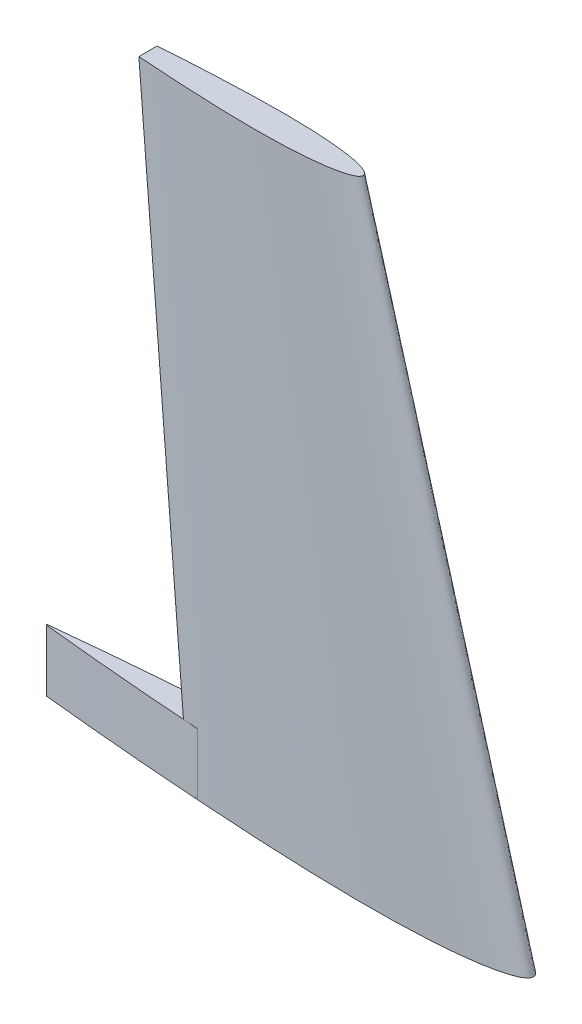
ISO-10303-21;
HEADER;
FILE_DESCRIPTION(('STEP AP214'),'2;1');
FILE_NAME('part.step','',(''),(''),'','','');
FILE_SCHEMA(('AUTOMOTIVE_DESIGN { 1 0 10303 214 1 1 1 1 }'));
ENDSEC;
DATA;
#1=APPLICATION_CONTEXT('core data for automotive mechanical design processes');
#2=APPLICATION_PROTOCOL_DEFINITION('international standard','automotive_design',2000,#1);
#3=PRODUCT_CONTEXT('',#1,'mechanical');
#4=PRODUCT('Part','Part','',(#3));
#5=PRODUCT_RELATED_PRODUCT_CATEGORY('part','',(#4));
#6=PRODUCT_DEFINITION_FORMATION('','',#4);
#7=PRODUCT_DEFINITION_CONTEXT('part definition',#1,'design');
#8=PRODUCT_DEFINITION('design','',#6,#7);
#9=PRODUCT_DEFINITION_SHAPE('','',#8);
#10=(LENGTH_UNIT() NAMED_UNIT(*) SI_UNIT(.MILLI.,.METRE.));
#11=(NAMED_UNIT(*) PLANE_ANGLE_UNIT() SI_UNIT($,.RADIAN.));
#12=(NAMED_UNIT(*) SI_UNIT($,.STERADIAN.) SOLID_ANGLE_UNIT());
#13=UNCERTAINTY_MEASURE_WITH_UNIT(LENGTH_MEASURE(1.E-05),#10,'distance_accuracy_value','');
#14=(GEOMETRIC_REPRESENTATION_CONTEXT(3) GLOBAL_UNCERTAINTY_ASSIGNED_CONTEXT((#13)) GLOBAL_UNIT_ASSIGNED_CONTEXT((#10,
#11,#12)) REPRESENTATION_CONTEXT('',''));
#15=CARTESIAN_POINT('',(0.,0.,0.));
#16=DIRECTION('',(0.,0.,1.));
#17=DIRECTION('',(1.,0.,0.));
#18=AXIS2_PLACEMENT_3D('',#15,#16,#17);
#19=CARTESIAN_POINT('',(-112.239366573117,-10.0566351564144,0.));
#20=DIRECTION('',(0.996009938224666,0.0892423831914909,0.));
#21=DIRECTION('',(-0.0892423831914909,0.996009938224666,0.));
#22=AXIS2_PLACEMENT_3D('',#19,#20,#21);
#23=PLANE('',#22);
#24=DIRECTION('',(0.,0.,-1.));
#25=VECTOR('',#24,1.);
#26=CARTESIAN_POINT('',(-115.022037738233,21.,0.));
#27=LINE('',#26,#25);
#28=CARTESIAN_POINT('',(-115.022037738233,21.,4.63619765220929));
#29=VERTEX_POINT('',#28);
#30=CARTESIAN_POINT('',(-115.022037738233,21.,-4.63619765220929));
#31=VERTEX_POINT('',#30);
#32=EDGE_CURVE('E135',#29,#31,#27,.T.);
#33=ORIENTED_EDGE('',*,*,#32,.F.);
#34=DIRECTION('',(-0.0892394877157666,0.995977622608541,-0.00805537679227205));
#35=VECTOR('',#34,1.);
#36=CARTESIAN_POINT('',(-113.14044,0.,4.80604374995059));
#37=LINE('',#36,#35);
#38=CARTESIAN_POINT('',(-131.775336,207.979,3.12392843746788));
#39=VERTEX_POINT('',#38);
#40=EDGE_CURVE('E147',#29,#39,#37,.T.);
#41=ORIENTED_EDGE('',*,*,#40,.T.);
#42=DIRECTION('',(0.,0.,1.));
#43=VECTOR('',#42,1.);
#44=CARTESIAN_POINT('',(-131.775336,207.979,-3.12392843746788));
#45=LINE('',#44,#43);
#46=CARTESIAN_POINT('',(-131.775336,207.979,-3.12392843746788));
#47=VERTEX_POINT('',#46);
#48=EDGE_CURVE('E155',#47,#39,#45,.T.);
#49=ORIENTED_EDGE('',*,*,#48,.F.);
#50=DIRECTION('',(-0.0892394877157666,0.995977622608541,0.00805537679227205));
#51=VECTOR('',#50,1.);
#52=CARTESIAN_POINT('',(-113.14044,0.,-4.80604374995059));
#53=LINE('',#52,#51);
#54=EDGE_CURVE('E148',#31,#47,#53,.T.);
#55=ORIENTED_EDGE('',*,*,#54,.F.);
#56=EDGE_LOOP('',(#33,#41,#49,#55));
#57=FACE_BOUND('',#56,.T.);
#58=ADVANCED_FACE('F41',(#57),#23,.F.);
#59=CARTESIAN_POINT('',(-113.14044,0.,4.80604374995059));
#60=CARTESIAN_POINT('',(-131.775336,207.979,3.12392843746788));
#61=CARTESIAN_POINT('',(-111.726732710091,0.,4.90713052679197));
#62=CARTESIAN_POINT('',(-130.856426261559,207.979,3.18963484241478));
#63=CARTESIAN_POINT('',(-107.510535807038,0.,5.20860860397274));
#64=CARTESIAN_POINT('',(-128.115898274575,207.979,3.38559559258228));
#65=CARTESIAN_POINT('',(-100.426385122024,0.,5.66512035387463));
#66=CARTESIAN_POINT('',(-123.511200329316,207.979,3.68232823001851));
#67=CARTESIAN_POINT('',(-91.8573991631088,0.,6.17181704190395));
#68=CARTESIAN_POINT('',(-117.941359456021,207.979,4.01168107723757));
#69=CARTESIAN_POINT('',(-83.1932560029528,0.,6.61846814689898));
#70=CARTESIAN_POINT('',(-112.309666401919,207.979,4.30200429548434));
#71=CARTESIAN_POINT('',(-74.5290382225057,0.,6.99169504156081));
#72=CARTESIAN_POINT('',(-106.677924844629,207.979,4.54460177701453));
#73=CARTESIAN_POINT('',(-65.959549844099,0.,7.27452823306303));
#74=CARTESIAN_POINT('',(-101.107757398664,207.979,4.72844335149097));
#75=CARTESIAN_POINT('',(-57.578619637256,0.,7.45200157022249));
#76=CARTESIAN_POINT('',(-95.6601527642164,207.979,4.84380102064462));
#77=CARTESIAN_POINT('',(-49.4779845535848,0.,7.51083783643772));
#78=CARTESIAN_POINT('',(-90.3947399598301,207.979,4.88204459368452));
#79=CARTESIAN_POINT('',(-41.7463108736929,0.,7.440783256186));
#80=CARTESIAN_POINT('',(-85.3691520679004,207.979,4.8365091165209));
#81=CARTESIAN_POINT('',(-34.468189505098,0.,7.23543189831716));
#82=CARTESIAN_POINT('',(-80.6383731783137,207.979,4.70303073390616));
#83=CARTESIAN_POINT('',(-27.7232217122839,0.,6.89282626183877));
#84=CARTESIAN_POINT('',(-76.2541441129845,207.979,4.4803370701952));
#85=CARTESIAN_POINT('',(-21.58491618977,0.,6.41597440914091));
#86=CARTESIAN_POINT('',(-72.2642455233505,207.979,4.1703833659416));
#87=CARTESIAN_POINT('',(-16.1202197147915,0.,5.81199661703474));
#88=CARTESIAN_POINT('',(-68.7121928146145,207.979,3.77779780107258));
#89=CARTESIAN_POINT('',(-11.3868645139334,0.,5.09394784864563));
#90=CARTESIAN_POINT('',(-65.6355119340567,207.979,3.31106610161966));
#91=CARTESIAN_POINT('',(-7.43652337095124,0.,4.27300728957677));
#92=CARTESIAN_POINT('',(-63.0677901911183,207.979,2.7774547382249));
#93=CARTESIAN_POINT('',(-4.29811628529668,0.,3.3773895414827));
#94=CARTESIAN_POINT('',(-61.0278255854428,207.979,2.19530320196376));
#95=CARTESIAN_POINT('',(-2.00522037449469,0.,2.39406602277235));
#96=CARTESIAN_POINT('',(-59.5374432434215,207.979,1.55614291480203));
#97=CARTESIAN_POINT('',(-0.477736378413801,0.,1.37816814860217));
#98=CARTESIAN_POINT('',(-58.544578645969,207.979,0.895809296591408));
#99=CARTESIAN_POINT('',(0.197509287891895,0.,0.));
#100=CARTESIAN_POINT('',(-58.1056689628703,207.979,0.));
#101=CARTESIAN_POINT('',(-0.477736378413796,0.,-1.37816814860216));
#102=CARTESIAN_POINT('',(-58.544578645969,207.979,-0.895809296591398));
#103=CARTESIAN_POINT('',(-2.0052203744947,0.,-2.39406602277236));
#104=CARTESIAN_POINT('',(-59.5374432434216,207.979,-1.55614291480204));
#105=CARTESIAN_POINT('',(-4.29811628529668,0.,-3.3773895414827));
#106=CARTESIAN_POINT('',(-61.0278255854428,207.979,-2.19530320196376));
#107=CARTESIAN_POINT('',(-7.43652337095122,0.,-4.27300728957676));
#108=CARTESIAN_POINT('',(-63.0677901911183,207.979,-2.77745473822489));
#109=CARTESIAN_POINT('',(-11.3868645139334,0.,-5.09394784864563));
#110=CARTESIAN_POINT('',(-65.6355119340567,207.979,-3.31106610161966));
#111=CARTESIAN_POINT('',(-16.1202197147915,0.,-5.81199661703474));
#112=CARTESIAN_POINT('',(-68.7121928146145,207.979,-3.77779780107258));
#113=CARTESIAN_POINT('',(-21.58491618977,0.,-6.41597440914091));
#114=CARTESIAN_POINT('',(-72.2642455233505,207.979,-4.1703833659416));
#115=CARTESIAN_POINT('',(-27.7232217122839,0.,-6.89282626183877));
#116=CARTESIAN_POINT('',(-76.2541441129845,207.979,-4.4803370701952));
#117=CARTESIAN_POINT('',(-34.468189505098,0.,-7.23543189831716));
#118=CARTESIAN_POINT('',(-80.6383731783137,207.979,-4.70303073390616));
#119=CARTESIAN_POINT('',(-41.7463108736929,0.,-7.440783256186));
#120=CARTESIAN_POINT('',(-85.3691520679004,207.979,-4.8365091165209));
#121=CARTESIAN_POINT('',(-49.4779845535848,0.,-7.51083783643772));
#122=CARTESIAN_POINT('',(-90.3947399598301,207.979,-4.88204459368452));
#123=CARTESIAN_POINT('',(-57.5786196372561,0.,-7.45200157022249));
#124=CARTESIAN_POINT('',(-95.6601527642164,207.979,-4.84380102064462));
#125=CARTESIAN_POINT('',(-65.9595498440989,0.,-7.27452823306304));
#126=CARTESIAN_POINT('',(-101.107757398664,207.979,-4.72844335149097));
#127=CARTESIAN_POINT('',(-74.5290382225058,0.,-6.99169504156081));
#128=CARTESIAN_POINT('',(-106.677924844629,207.979,-4.54460177701453));
#129=CARTESIAN_POINT('',(-83.1932560029527,0.,-6.61846814689898));
#130=CARTESIAN_POINT('',(-112.309666401919,207.979,-4.30200429548434));
#131=CARTESIAN_POINT('',(-91.8573991631088,0.,-6.17181704190396));
#132=CARTESIAN_POINT('',(-117.941359456021,207.979,-4.01168107723757));
#133=CARTESIAN_POINT('',(-100.426385122024,0.,-5.66512035387463));
#134=CARTESIAN_POINT('',(-123.511200329316,207.979,-3.68232823001851));
#135=CARTESIAN_POINT('',(-107.510535807038,0.,-5.20860860397274));
#136=CARTESIAN_POINT('',(-128.115898274575,207.979,-3.38559559258228));
#137=CARTESIAN_POINT('',(-111.726732710091,0.,-4.90713052679197));
#138=CARTESIAN_POINT('',(-130.856426261559,207.979,-3.18963484241478));
#139=CARTESIAN_POINT('',(-113.14044,0.,-4.80604374995059));
#140=CARTESIAN_POINT('',(-131.775336,207.979,-3.12392843746788));
#141=B_SPLINE_SURFACE_WITH_KNOTS('',3,1,((#59,#60),(#61,#62),(#63,#64),(#65,#66),(#67,#68),(#69,
#70),(#71,#72),(#73,#74),(#75,#76),(#77,#78),(#79,#80),(#81,#82),(#83,#84),(#85,#86),(#87,#88),
(#89,#90),(#91,#92),(#93,#94),(#95,#96),(#97,#98),(#99,#100),(#101,#102),(#103,#104),(#105,
#106),(#107,#108),(#109,#110),(#111,#112),(#113,#114),(#115,#116),(#117,#118),(#119,#120),(#121,
#122),(#123,#124),(#125,#126),(#127,#128),(#129,#130),(#131,#132),(#133,#134),(#135,#136),(#137,
#138),(#139,#140)),.UNSPECIFIED.,.F.,.F.,.F.,(4,1,1,1,1,1,1,1,1,1,1,1,1,1,1,1,1,1,1,1,1,1,1,1,1,
1,1,1,1,1,1,1,1,1,1,1,1,1,4),(2,2),(0.,0.0184991990313921,0.0551714391103741,0.0926551947459052,
0.130538861378944,0.168407204268983,0.205846371784387,0.242448967142613,0.277819055280114,
0.31157698184847,0.343363918285861,0.372846133093968,0.399719140493533,0.423712132827816,
0.44459359078009,0.462180115204489,0.476353861047873,0.487105624794223,0.494669112548724,0.5,
0.505330887451276,0.512894375205777,0.523646138952127,0.537819884795511,0.55540640921991,
0.576287867172184,0.600280859506467,0.627153866906032,0.656636081714139,0.68842301815153,
0.722180944719886,0.757551032857387,0.794153628215613,0.831592795731017,0.869461138621057,
0.907344805254095,0.944828560889626,0.981500800968608,1.),(0.,1.),.UNSPECIFIED.);
#142=CARTESIAN_POINT('',(-109.81278,21.,5.00209594089317));
#143=CARTESIAN_POINT('',(-109.81278,19.9689428961202,5.00418690433827));
#144=CARTESIAN_POINT('',(-109.81278,18.9378857559289,5.00626004717863));
#145=CARTESIAN_POINT('',(-109.81278,13.7825998728371,5.01653903370571));
#146=CARTESIAN_POINT('',(-109.81278,9.65837060834619,5.02448469431764));
#147=CARTESIAN_POINT('',(-109.81278,3.87452028296193,5.03528117861113));
#148=CARTESIAN_POINT('',(-109.81278,2.21489960580264,5.0383391093769));
#149=CARTESIAN_POINT('',(-109.81278,0.555278860915631,5.0413590040875));
#150=B_SPLINE_CURVE_WITH_KNOTS('',3,(#142,#143,#144,#145,#146,#147,#148,#149),.UNSPECIFIED.,.F.,
.F.,(4,2,2,4),(0.,3.09317767267523,15.4658883881913,20.4447588684718),.UNSPECIFIED.);
#151=CARTESIAN_POINT('',(-109.81278,21.,5.00209594089318));
#152=VERTEX_POINT('',#151);
#153=CARTESIAN_POINT('',(-109.81278,0.55527886091563,5.04135900408749));
#154=VERTEX_POINT('',#153);
#155=EDGE_CURVE('E54',#152,#154,#150,.T.);
#156=CARTESIAN_POINT('',(-109.81278,0.555278860916699,5.04135900408749));
#157=CARTESIAN_POINT('',(-109.856025575846,0.547658741315501,5.03834572506937));
#158=CARTESIAN_POINT('',(-109.899016126712,0.538658260161525,5.03535021254431));
#159=CARTESIAN_POINT('',(-109.984302066192,0.518166545737121,5.02940754240784));
#160=CARTESIAN_POINT('',(-110.026598803445,0.506680973147267,5.02646029101222));
#161=CARTESIAN_POINT('',(-110.110483614082,0.481459721104076,5.02061500830226));
#162=CARTESIAN_POINT('',(-110.152072081605,0.467725341461792,5.01771694961622));
#163=CARTESIAN_POINT('',(-110.31564439753,0.409248685916173,5.00631807982476));
#164=CARTESIAN_POINT('',(-110.434871240147,0.356649330986225,4.99800847308142));
#165=CARTESIAN_POINT('',(-110.637673903591,0.254211567218491,4.98387092624484));
#166=CARTESIAN_POINT('',(-110.722654370449,0.207025465866959,4.97794586008609));
#167=CARTESIAN_POINT('',(-110.848239906469,0.132264437837669,4.96918786578134));
#168=CARTESIAN_POINT('',(-110.889960023809,0.106563134054411,4.96627810251404));
#169=CARTESIAN_POINT('',(-110.972704251843,0.0540616109841938,4.96050643887641));
#170=CARTESIAN_POINT('',(-111.013728398919,0.0272614493930928,4.95764453600425));
#171=CARTESIAN_POINT('',(-111.054439004273,0.,4.95480413952661));
#172=B_SPLINE_CURVE_WITH_KNOTS('',3,(#156,#157,#158,#159,#160,#161,#162,#163,#164,#165,#166,
#167,#168,#169,#170,#171),.UNSPECIFIED.,.F.,.F.,(4,2,2,2,2,2,2,4),(0.,0.132005143398365,
0.263712705577792,0.395344407759165,0.785872314369844,1.07785907741558,1.22510386874522,
1.37234093881848),.UNSPECIFIED.);
#173=CARTESIAN_POINT('',(-111.054432366344,0.,4.95480461036512));
#174=VERTEX_POINT('',#173);
#175=EDGE_CURVE('E11',#154,#174,#172,.T.);
#176=CARTESIAN_POINT('',(-113.14044,0.,4.80604374995059));
#177=CARTESIAN_POINT('',(-111.726732710091,0.,4.90713052679197));
#178=CARTESIAN_POINT('',(-107.510535807038,0.,5.20860860397274));
#179=CARTESIAN_POINT('',(-100.426385122024,0.,5.66512035387463));
#180=CARTESIAN_POINT('',(-91.8573991631088,0.,6.17181704190395));
#181=CARTESIAN_POINT('',(-83.1932560029528,0.,6.61846814689898));
#182=CARTESIAN_POINT('',(-74.5290382225057,0.,6.99169504156081));
#183=CARTESIAN_POINT('',(-65.959549844099,0.,7.27452823306303));
#184=CARTESIAN_POINT('',(-57.578619637256,0.,7.45200157022249));
#185=CARTESIAN_POINT('',(-49.4779845535848,0.,7.51083783643772));
#186=CARTESIAN_POINT('',(-41.7463108736929,0.,7.440783256186));
#187=CARTESIAN_POINT('',(-34.468189505098,0.,7.23543189831716));
#188=CARTESIAN_POINT('',(-27.7232217122839,0.,6.89282626183877));
#189=CARTESIAN_POINT('',(-21.58491618977,0.,6.41597440914091));
#190=CARTESIAN_POINT('',(-16.1202197147915,0.,5.81199661703474));
#191=CARTESIAN_POINT('',(-11.3868645139334,0.,5.09394784864563));
#192=CARTESIAN_POINT('',(-7.43652337095124,0.,4.27300728957677));
#193=CARTESIAN_POINT('',(-4.29811628529668,0.,3.3773895414827));
#194=CARTESIAN_POINT('',(-2.00522037449469,0.,2.39406602277235));
#195=CARTESIAN_POINT('',(-0.477736378413801,0.,1.37816814860217));
#196=CARTESIAN_POINT('',(0.197509287891895,0.,0.));
#197=CARTESIAN_POINT('',(-0.477736378413796,0.,-1.37816814860216));
#198=CARTESIAN_POINT('',(-2.0052203744947,0.,-2.39406602277236));
#199=CARTESIAN_POINT('',(-4.29811628529668,0.,-3.3773895414827));
#200=CARTESIAN_POINT('',(-7.43652337095122,0.,-4.27300728957676));
#201=CARTESIAN_POINT('',(-11.3868645139334,0.,-5.09394784864563));
#202=CARTESIAN_POINT('',(-16.1202197147915,0.,-5.81199661703474));
#203=CARTESIAN_POINT('',(-21.58491618977,0.,-6.41597440914091));
#204=CARTESIAN_POINT('',(-27.7232217122839,0.,-6.89282626183877));
#205=CARTESIAN_POINT('',(-34.468189505098,0.,-7.23543189831716));
#206=CARTESIAN_POINT('',(-41.7463108736929,0.,-7.440783256186));
#207=CARTESIAN_POINT('',(-49.4779845535848,0.,-7.51083783643772));
#208=CARTESIAN_POINT('',(-57.5786196372561,0.,-7.45200157022249));
#209=CARTESIAN_POINT('',(-65.9595498440989,0.,-7.27452823306304));
#210=CARTESIAN_POINT('',(-74.5290382225058,0.,-6.99169504156081));
#211=CARTESIAN_POINT('',(-83.1932560029527,0.,-6.61846814689898));
#212=CARTESIAN_POINT('',(-91.8573991631088,0.,-6.17181704190396));
#213=CARTESIAN_POINT('',(-100.426385122024,0.,-5.66512035387463));
#214=CARTESIAN_POINT('',(-107.510535807038,0.,-5.20860860397274));
#215=CARTESIAN_POINT('',(-111.726732710091,0.,-4.90713052679197));
#216=CARTESIAN_POINT('',(-113.14044,0.,-4.80604374995059));
#217=B_SPLINE_CURVE_WITH_KNOTS('',3,(#176,#177,#178,#179,#180,#181,#182,#183,#184,#185,#186,
#187,#188,#189,#190,#191,#192,#193,#194,#195,#196,#197,#198,#199,#200,#201,#202,#203,#204,#205,
#206,#207,#208,#209,#210,#211,#212,#213,#214,#215,#216),.UNSPECIFIED.,.F.,.F.,(4,1,1,1,1,1,1,1,
1,1,1,1,1,1,1,1,1,1,1,1,1,1,1,1,1,1,1,1,1,1,1,1,1,1,1,1,1,1,4),(0.,0.0184991990313921,
0.0551714391103741,0.0926551947459052,0.130538861378944,0.168407204268983,0.205846371784387,
0.242448967142613,0.277819055280114,0.31157698184847,0.343363918285861,0.372846133093968,
0.399719140493533,0.423712132827816,0.44459359078009,0.462180115204489,0.476353861047873,
0.487105624794223,0.494669112548724,0.5,0.505330887451276,0.512894375205777,0.523646138952127,
0.537819884795511,0.55540640921991,0.576287867172184,0.600280859506467,0.627153866906032,
0.656636081714139,0.68842301815153,0.722180944719886,0.757551032857387,0.794153628215613,
0.831592795731017,0.869461138621057,0.907344805254095,0.944828560889626,0.981500800968608,1.),.UNSPECIFIED.);
#218=CARTESIAN_POINT('',(-111.054432366346,0.,-4.95480461036498));
#219=VERTEX_POINT('',#218);
#220=EDGE_CURVE('E138',#174,#219,#217,.T.);
#221=CARTESIAN_POINT('',(-111.054439003014,0.,-4.95480413961515));
#222=CARTESIAN_POINT('',(-111.002690490525,0.0346459491797154,-4.95841465642155));
#223=CARTESIAN_POINT('',(-110.950434901074,0.0685577375960745,-4.96205995395753));
#224=CARTESIAN_POINT('',(-110.844498963656,0.134694986812781,-4.96944883982063));
#225=CARTESIAN_POINT('',(-110.790812638982,0.16691080573069,-4.97319283938602));
#226=CARTESIAN_POINT('',(-110.682039565042,0.22912728278207,-4.98077751053247));
#227=CARTESIAN_POINT('',(-110.626950461749,0.259123835327018,-4.98461834448921));
#228=CARTESIAN_POINT('',(-110.516556861593,0.315728844923395,-4.99231418045917));
#229=CARTESIAN_POINT('',(-110.461282773563,0.342396533115959,-4.99616708071839));
#230=CARTESIAN_POINT('',(-110.349397637503,0.392507921541173,-5.0039653988712));
#231=CARTESIAN_POINT('',(-110.292788930091,0.415956836022864,-5.0079106547189));
#232=CARTESIAN_POINT('',(-110.178214716175,0.459051025062448,-5.0158952201954));
#233=CARTESIAN_POINT('',(-110.120251065133,0.478701194656941,-5.01993440116734));
#234=CARTESIAN_POINT('',(-110.020844925499,0.508268094895096,-5.02686122553768));
#235=CARTESIAN_POINT('',(-109.979740522046,0.519327356958681,-5.02972539016261));
#236=CARTESIAN_POINT('',(-109.89676761744,0.539127776856635,-5.03550688471686));
#237=CARTESIAN_POINT('',(-109.854896349081,0.547857242763599,-5.0384244070853));
#238=CARTESIAN_POINT('',(-109.81278,0.555278860917539,-5.04135900408751));
#239=B_SPLINE_CURVE_WITH_KNOTS('',3,(#221,#222,#223,#224,#225,#226,#227,#228,#229,#230,#231,
#232,#233,#234,#235,#236,#237,#238),.UNSPECIFIED.,.F.,.F.,(4,2,2,2,2,2,2,2,4),(0.,
0.187156541891788,0.375282258056178,0.563747723766881,0.748138418552106,0.932226792890676,
1.11607634747522,1.24399883536122,1.37255171122407),.UNSPECIFIED.);
#240=CARTESIAN_POINT('',(-109.81278,0.555278860918583,-5.04135900408749));
#241=VERTEX_POINT('',#240);
#242=EDGE_CURVE('E194',#219,#241,#239,.T.);
#243=CARTESIAN_POINT('',(-109.81278,0.555278860918583,-5.04135900408749));
#244=CARTESIAN_POINT('',(-109.81278,1.58633637589825,-5.03948185057679));
#245=CARTESIAN_POINT('',(-109.81278,2.61739386547721,-5.03759045259363));
#246=CARTESIAN_POINT('',(-109.81278,7.77268118501841,-5.0280592223386));
#247=CARTESIAN_POINT('',(-109.81278,11.8969106075241,-5.02019666908959));
#248=CARTESIAN_POINT('',(-109.81278,17.6807597461503,-5.00878282266112));
#249=CARTESIAN_POINT('',(-109.81278,19.3403799210768,-5.00546300307681));
#250=CARTESIAN_POINT('',(-109.81278,21.,-5.00209594089318));
#251=B_SPLINE_CURVE_WITH_KNOTS('',3,(#243,#244,#245,#246,#247,#248,#249,#250),.UNSPECIFIED.,.F.,
.F.,(4,2,2,4),(0.,3.09317767251933,15.4658883849923,20.4447588686418),.UNSPECIFIED.);
#252=CARTESIAN_POINT('',(-109.81278,21.,-5.00209594089318));
#253=VERTEX_POINT('',#252);
#254=EDGE_CURVE('E172',#241,#253,#251,.T.);
#255=CARTESIAN_POINT('',(-109.81278,21.,-5.00209594089318));
#256=CARTESIAN_POINT('',(-110.069954088652,21.,-4.98464598366869));
#257=CARTESIAN_POINT('',(-110.327120121902,21.,-4.96707749323498));
#258=CARTESIAN_POINT('',(-110.841436791184,21.,-4.93171768709047));
#259=CARTESIAN_POINT('',(-111.098587427221,21.,-4.91392637144851));
#260=CARTESIAN_POINT('',(-111.870017103736,21.,-4.86023956305424));
#261=CARTESIAN_POINT('',(-112.384274357139,21.,-4.82403117862227));
#262=CARTESIAN_POINT('',(-113.252445864665,21.,-4.76250523585215));
#263=CARTESIAN_POINT('',(-113.606368928283,21.,-4.73731137254243));
#264=CARTESIAN_POINT('',(-114.314207268438,21.,-4.68681124186549));
#265=CARTESIAN_POINT('',(-114.66812254497,21.,-4.66150497442675));
#266=CARTESIAN_POINT('',(-115.022037738233,21.,-4.63619765220929));
#267=B_SPLINE_CURVE_WITH_KNOTS('',3,(#255,#256,#257,#258,#259,#260,#261,#262,#263,#264,#265,
#266),.UNSPECIFIED.,.F.,.F.,(4,2,2,2,2,4),(0.,0.773296221502586,1.546592204134,3.0931828327618,
4.15763874536042,5.22209533551836),.UNSPECIFIED.);
#268=EDGE_CURVE('E158',#253,#31,#267,.T.);
#269=CARTESIAN_POINT('',(-131.775336,207.979,3.12392843746788));
#270=CARTESIAN_POINT('',(-130.856426261559,207.979,3.18963484241478));
#271=CARTESIAN_POINT('',(-128.115898274575,207.979,3.38559559258228));
#272=CARTESIAN_POINT('',(-123.511200329316,207.979,3.68232823001851));
#273=CARTESIAN_POINT('',(-117.941359456021,207.979,4.01168107723757));
#274=CARTESIAN_POINT('',(-112.309666401919,207.979,4.30200429548434));
#275=CARTESIAN_POINT('',(-106.677924844629,207.979,4.54460177701453));
#276=CARTESIAN_POINT('',(-101.107757398664,207.979,4.72844335149097));
#277=CARTESIAN_POINT('',(-95.6601527642164,207.979,4.84380102064462));
#278=CARTESIAN_POINT('',(-90.3947399598301,207.979,4.88204459368452));
#279=CARTESIAN_POINT('',(-85.3691520679004,207.979,4.8365091165209));
#280=CARTESIAN_POINT('',(-80.6383731783137,207.979,4.70303073390616));
#281=CARTESIAN_POINT('',(-76.2541441129845,207.979,4.4803370701952));
#282=CARTESIAN_POINT('',(-72.2642455233505,207.979,4.1703833659416));
#283=CARTESIAN_POINT('',(-68.7121928146145,207.979,3.77779780107258));
#284=CARTESIAN_POINT('',(-65.6355119340567,207.979,3.31106610161966));
#285=CARTESIAN_POINT('',(-63.0677901911183,207.979,2.7774547382249));
#286=CARTESIAN_POINT('',(-61.0278255854428,207.979,2.19530320196376));
#287=CARTESIAN_POINT('',(-59.5374432434215,207.979,1.55614291480203));
#288=CARTESIAN_POINT('',(-58.544578645969,207.979,0.895809296591408));
#289=CARTESIAN_POINT('',(-58.1056689628703,207.979,0.));
#290=CARTESIAN_POINT('',(-58.544578645969,207.979,-0.895809296591398));
#291=CARTESIAN_POINT('',(-59.5374432434216,207.979,-1.55614291480204));
#292=CARTESIAN_POINT('',(-61.0278255854428,207.979,-2.19530320196376));
#293=CARTESIAN_POINT('',(-63.0677901911183,207.979,-2.77745473822489));
#294=CARTESIAN_POINT('',(-65.6355119340567,207.979,-3.31106610161966));
#295=CARTESIAN_POINT('',(-68.7121928146145,207.979,-3.77779780107258));
#296=CARTESIAN_POINT('',(-72.2642455233505,207.979,-4.1703833659416));
#297=CARTESIAN_POINT('',(-76.2541441129845,207.979,-4.4803370701952));
#298=CARTESIAN_POINT('',(-80.6383731783137,207.979,-4.70303073390616));
#299=CARTESIAN_POINT('',(-85.3691520679004,207.979,-4.8365091165209));
#300=CARTESIAN_POINT('',(-90.3947399598301,207.979,-4.88204459368452));
#301=CARTESIAN_POINT('',(-95.6601527642164,207.979,-4.84380102064462));
#302=CARTESIAN_POINT('',(-101.107757398664,207.979,-4.72844335149097));
#303=CARTESIAN_POINT('',(-106.677924844629,207.979,-4.54460177701453));
#304=CARTESIAN_POINT('',(-112.309666401919,207.979,-4.30200429548434));
#305=CARTESIAN_POINT('',(-117.941359456021,207.979,-4.01168107723757));
#306=CARTESIAN_POINT('',(-123.511200329316,207.979,-3.68232823001851));
#307=CARTESIAN_POINT('',(-128.115898274575,207.979,-3.38559559258228));
#308=CARTESIAN_POINT('',(-130.856426261559,207.979,-3.18963484241478));
#309=CARTESIAN_POINT('',(-131.775336,207.979,-3.12392843746788));
#310=B_SPLINE_CURVE_WITH_KNOTS('',3,(#269,#270,#271,#272,#273,#274,#275,#276,#277,#278,#279,
#280,#281,#282,#283,#284,#285,#286,#287,#288,#289,#290,#291,#292,#293,#294,#295,#296,#297,#298,
#299,#300,#301,#302,#303,#304,#305,#306,#307,#308,#309),.UNSPECIFIED.,.F.,.F.,(4,1,1,1,1,1,1,1,
1,1,1,1,1,1,1,1,1,1,1,1,1,1,1,1,1,1,1,1,1,1,1,1,1,1,1,1,1,1,4),(0.,0.0184991990313922,
0.0551714391103743,0.0926551947459053,0.130538861378944,0.168407204268983,0.205846371784387,
0.242448967142613,0.277819055280114,0.31157698184847,0.343363918285861,0.372846133093968,
0.399719140493533,0.423712132827816,0.44459359078009,0.462180115204489,0.476353861047873,
0.487105624794223,0.494669112548724,0.5,0.505330887451276,0.512894375205777,0.523646138952127,
0.537819884795511,0.55540640921991,0.576287867172184,0.600280859506467,0.627153866906032,
0.656636081714139,0.68842301815153,0.722180944719886,0.757551032857387,0.794153628215613,
0.831592795731017,0.869461138621056,0.907344805254095,0.944828560889626,0.981500800968608,1.),.UNSPECIFIED.);
#311=EDGE_CURVE('E153',#39,#47,#310,.T.);
#312=CARTESIAN_POINT('',(-115.022037738233,21.,4.63619765220929));
#313=CARTESIAN_POINT('',(-114.507820517595,21.,4.67296277724015));
#314=CARTESIAN_POINT('',(-113.993603454037,21.,4.70973365923194));
#315=CARTESIAN_POINT('',(-112.965145435899,21.,4.78293065738207));
#316=CARTESIAN_POINT('',(-112.450904481347,21.,4.81935677394495));
#317=CARTESIAN_POINT('',(-111.582689307555,21.,4.88026190882128));
#318=CARTESIAN_POINT('',(-111.228728062273,21.,4.90492538244156));
#319=CARTESIAN_POINT('',(-110.520776810584,21.,4.95383999501059));
#320=CARTESIAN_POINT('',(-110.166786804154,21.,4.97809113362629));
#321=CARTESIAN_POINT('',(-109.81278,21.,5.00209594089318));
#322=B_SPLINE_CURVE_WITH_KNOTS('',3,(#312,#313,#314,#315,#316,#317,#318,#319,#320,#321),
.UNSPECIFIED.,.F.,.F.,(4,2,2,2,4),(0.,1.54658998492907,3.09317815490822,4.1576363022747,
5.22209530939111),.UNSPECIFIED.);
#323=EDGE_CURVE('E64',#29,#152,#322,.T.);
#324=ORIENTED_EDGE('',*,*,#155,.T.);
#325=ORIENTED_EDGE('',*,*,#175,.T.);
#326=ORIENTED_EDGE('',*,*,#220,.T.);
#327=ORIENTED_EDGE('',*,*,#242,.T.);
#328=ORIENTED_EDGE('',*,*,#254,.T.);
#329=ORIENTED_EDGE('',*,*,#268,.T.);
#330=ORIENTED_EDGE('',*,*,#54,.T.);
#331=ORIENTED_EDGE('',*,*,#311,.F.);
#332=ORIENTED_EDGE('',*,*,#40,.F.);
#333=ORIENTED_EDGE('',*,*,#323,.T.);
#334=EDGE_LOOP('',(#324,#325,#326,#327,#328,#329,#330,#331,#332,#333));
#335=FACE_BOUND('',#334,.T.);
#336=ADVANCED_FACE('F179',(#335),#141,.T.);
#337=CARTESIAN_POINT('',(-58.23405,207.979,0.));
#338=DIRECTION('',(0.,1.,0.));
#339=DIRECTION('',(0.,0.,1.));
#340=AXIS2_PLACEMENT_3D('',#337,#338,#339);
#341=PLANE('',#340);
#342=ORIENTED_EDGE('',*,*,#311,.T.);
#343=ORIENTED_EDGE('',*,*,#48,.T.);
#344=EDGE_LOOP('',(#342,#343));
#345=FACE_BOUND('',#344,.T.);
#346=ADVANCED_FACE('F43',(#345),#341,.T.);
#347=CARTESIAN_POINT('',(0.,0.,0.));
#348=DIRECTION('',(0.,1.,0.));
#349=DIRECTION('',(0.,0.,1.));
#350=AXIS2_PLACEMENT_3D('',#347,#348,#349);
#351=PLANE('',#350);
#352=ORIENTED_EDGE('',*,*,#220,.F.);
#353=CARTESIAN_POINT('',(-166.383,0.,0.157231934999997));
#354=CARTESIAN_POINT('',(-166.231090479825,0.,0.17320090360325));
#355=CARTESIAN_POINT('',(-165.62514991158,0.,0.236898332826921));
#356=CARTESIAN_POINT('',(-164.268013015421,0.,0.378471066367312));
#357=CARTESIAN_POINT('',(-162.022640503955,0.,0.609682440553916));
#358=CARTESIAN_POINT('',(-158.913606154651,0.,0.923567812838026));
#359=CARTESIAN_POINT('',(-154.974960133064,0.,1.31123056210274));
#360=CARTESIAN_POINT('',(-150.249838669998,0.,1.76217277136998));
#361=CARTESIAN_POINT('',(-144.790004898854,0.,2.26491761896149));
#362=CARTESIAN_POINT('',(-138.655272750859,0.,2.80729566345785));
#363=CARTESIAN_POINT('',(-131.912879847387,0.,3.37711704100301));
#364=CARTESIAN_POINT('',(-124.636627943678,0.,3.96050912303019));
#365=CARTESIAN_POINT('',(-117.211013250691,0.,4.52586224856435));
#366=CARTESIAN_POINT('',(-112.218209698348,0.,4.87375260900367));
#367=CARTESIAN_POINT('',(-109.81278,0.,5.04135900408749));
#368=B_SPLINE_CURVE_WITH_KNOTS('',3,(#353,#354,#355,#356,#357,#358,#359,#360,#361,#362,#363,
#364,#365,#366,#367),.UNSPECIFIED.,.F.,.F.,(4,1,1,1,1,1,1,1,1,1,1,1,4),(0.,0.00806992419661268,
0.0321895194439434,0.0720894725721872,0.127324923855723,0.197281241513438,0.281181722650916,
0.378096945041151,0.486955528822678,0.606556134629911,0.735580601250078,0.872608191388973,1.),.UNSPECIFIED.);
#369=CARTESIAN_POINT('',(-166.383,0.,0.157231934999997));
#370=VERTEX_POINT('',#369);
#371=EDGE_CURVE('E128',#370,#174,#368,.T.);
#372=ORIENTED_EDGE('',*,*,#371,.F.);
#373=DIRECTION('',(0.,0.,1.));
#374=VECTOR('',#373,1.);
#375=CARTESIAN_POINT('',(-166.383,0.,-0.157231934999997));
#376=LINE('',#375,#374);
#377=CARTESIAN_POINT('',(-166.383,0.,-0.157231934999997));
#378=VERTEX_POINT('',#377);
#379=EDGE_CURVE('E256',#378,#370,#376,.T.);
#380=ORIENTED_EDGE('',*,*,#379,.F.);
#381=CARTESIAN_POINT('',(-109.81278,0.,-5.04135900408749));
#382=CARTESIAN_POINT('',(-112.218209698348,0.,-4.87375260900367));
#383=CARTESIAN_POINT('',(-117.211013250691,0.,-4.52586224856435));
#384=CARTESIAN_POINT('',(-124.636627943678,0.,-3.96050912303019));
#385=CARTESIAN_POINT('',(-131.912879847387,0.,-3.37711704100301));
#386=CARTESIAN_POINT('',(-138.655272750859,0.,-2.80729566345785));
#387=CARTESIAN_POINT('',(-144.790004898854,0.,-2.26491761896149));
#388=CARTESIAN_POINT('',(-150.249838669998,0.,-1.76217277136998));
#389=CARTESIAN_POINT('',(-154.974960133064,0.,-1.31123056210274));
#390=CARTESIAN_POINT('',(-158.913606154651,0.,-0.923567812838026));
#391=CARTESIAN_POINT('',(-162.022640503955,0.,-0.609682440553916));
#392=CARTESIAN_POINT('',(-164.268013015421,0.,-0.378471066367312));
#393=CARTESIAN_POINT('',(-165.62514991158,0.,-0.236898332826921));
#394=CARTESIAN_POINT('',(-166.231090479825,0.,-0.17320090360325));
#395=CARTESIAN_POINT('',(-166.383,0.,-0.157231934999997));
#396=B_SPLINE_CURVE_WITH_KNOTS('',3,(#381,#382,#383,#384,#385,#386,#387,#388,#389,#390,#391,
#392,#393,#394,#395),.UNSPECIFIED.,.F.,.F.,(4,1,1,1,1,1,1,1,1,1,1,1,4),(0.,0.127391808611027,
0.264419398749922,0.393443865370089,0.513044471177322,0.621903054958849,0.718818277349084,
0.802718758486562,0.872675076144277,0.927910527427813,0.967810480556057,0.991930075803387,1.),.UNSPECIFIED.);
#397=EDGE_CURVE('E133',#219,#378,#396,.T.);
#398=ORIENTED_EDGE('',*,*,#397,.F.);
#399=EDGE_LOOP('',(#352,#372,#380,#398));
#400=FACE_BOUND('',#399,.T.);
#401=ADVANCED_FACE('F209',(#400),#351,.F.);
#402=CARTESIAN_POINT('',(-109.81278,21.,-5.04135900408749));
#403=DIRECTION('',(-1.,0.,0.));
#404=DIRECTION('',(0.,0.,1.));
#405=AXIS2_PLACEMENT_3D('',#402,#403,#404);
#406=PLANE('',#405);
#407=ORIENTED_EDGE('',*,*,#155,.F.);
#408=DIRECTION('',(0.,0.,-1.));
#409=VECTOR('',#408,1.);
#410=CARTESIAN_POINT('',(-109.81278,21.,-5.04135900408749));
#411=LINE('',#410,#409);
#412=CARTESIAN_POINT('',(-109.81278,21.,5.04135900408749));
#413=VERTEX_POINT('',#412);
#414=EDGE_CURVE('E221',#413,#152,#411,.T.);
#415=ORIENTED_EDGE('',*,*,#414,.F.);
#416=DIRECTION('',(0.,-1.,0.));
#417=VECTOR('',#416,1.);
#418=CARTESIAN_POINT('',(-109.81278,21.,5.04135900408749));
#419=LINE('',#418,#417);
#420=EDGE_CURVE('E140',#413,#154,#419,.T.);
#421=ORIENTED_EDGE('',*,*,#420,.T.);
#422=EDGE_LOOP('',(#407,#415,#421));
#423=FACE_BOUND('',#422,.T.);
#424=ADVANCED_FACE('F208',(#423),#406,.F.);
#425=CARTESIAN_POINT('',(-109.81278,21.,-5.04135900408749));
#426=CARTESIAN_POINT('',(-112.218209698348,21.,-4.87375260900367));
#427=CARTESIAN_POINT('',(-117.211013250691,21.,-4.52586224856435));
#428=CARTESIAN_POINT('',(-124.636627943678,21.,-3.96050912303019));
#429=CARTESIAN_POINT('',(-131.912879847387,21.,-3.37711704100301));
#430=CARTESIAN_POINT('',(-138.655272750859,21.,-2.80729566345785));
#431=CARTESIAN_POINT('',(-144.790004898854,21.,-2.26491761896149));
#432=CARTESIAN_POINT('',(-150.249838669998,21.,-1.76217277136998));
#433=CARTESIAN_POINT('',(-154.974960133064,21.,-1.31123056210274));
#434=CARTESIAN_POINT('',(-158.913606154651,21.,-0.923567812838026));
#435=CARTESIAN_POINT('',(-162.022640503955,21.,-0.609682440553916));
#436=CARTESIAN_POINT('',(-164.268013015421,21.,-0.378471066367312));
#437=CARTESIAN_POINT('',(-165.62514991158,21.,-0.236898332826921));
#438=CARTESIAN_POINT('',(-166.231090479825,21.,-0.17320090360325));
#439=CARTESIAN_POINT('',(-166.383,21.,-0.157231934999997));
#440=B_SPLINE_CURVE_WITH_KNOTS('',3,(#425,#426,#427,#428,#429,#430,#431,#432,#433,#434,#435,
#436,#437,#438,#439),.UNSPECIFIED.,.F.,.F.,(4,1,1,1,1,1,1,1,1,1,1,1,4),(0.,0.127391808611027,
0.264419398749922,0.393443865370089,0.513044471177322,0.621903054958849,0.718818277349084,
0.802718758486562,0.872675076144277,0.927910527427813,0.967810480556057,0.991930075803387,1.),.UNSPECIFIED.);
#441=DIRECTION('',(0.,-1.,0.));
#442=VECTOR('',#441,1.);
#443=SURFACE_OF_LINEAR_EXTRUSION('',#440,#442);
#444=ORIENTED_EDGE('',*,*,#242,.F.);
#445=ORIENTED_EDGE('',*,*,#397,.T.);
#446=DIRECTION('',(0.,-1.,0.));
#447=VECTOR('',#446,1.);
#448=CARTESIAN_POINT('',(-166.383,21.,-0.157231934999997));
#449=LINE('',#448,#447);
#450=CARTESIAN_POINT('',(-166.383,21.,-0.157231934999997));
#451=VERTEX_POINT('',#450);
#452=EDGE_CURVE('E112',#451,#378,#449,.T.);
#453=ORIENTED_EDGE('',*,*,#452,.F.);
#454=CARTESIAN_POINT('',(-109.81278,21.,-5.04135900408749));
#455=VERTEX_POINT('',#454);
#456=EDGE_CURVE('E118',#455,#451,#440,.T.);
#457=ORIENTED_EDGE('',*,*,#456,.F.);
#458=DIRECTION('',(0.,-1.,0.));
#459=VECTOR('',#458,1.);
#460=CARTESIAN_POINT('',(-109.81278,21.,-5.04135900408749));
#461=LINE('',#460,#459);
#462=EDGE_CURVE('E249',#455,#241,#461,.T.);
#463=ORIENTED_EDGE('',*,*,#462,.T.);
#464=EDGE_LOOP('',(#444,#445,#453,#457,#463));
#465=FACE_BOUND('',#464,.T.);
#466=ADVANCED_FACE('F131',(#465),#443,.F.);
#467=CARTESIAN_POINT('',(-166.383,21.,-0.157231934999997));
#468=DIRECTION('',(1.,0.,0.));
#469=DIRECTION('',(0.,0.,-1.));
#470=AXIS2_PLACEMENT_3D('',#467,#468,#469);
#471=PLANE('',#470);
#472=ORIENTED_EDGE('',*,*,#379,.T.);
#473=DIRECTION('',(0.,-1.,0.));
#474=VECTOR('',#473,1.);
#475=CARTESIAN_POINT('',(-166.383,21.,0.157231934999997));
#476=LINE('',#475,#474);
#477=CARTESIAN_POINT('',(-166.383,21.,0.157231934999997));
#478=VERTEX_POINT('',#477);
#479=EDGE_CURVE('E114',#478,#370,#476,.T.);
#480=ORIENTED_EDGE('',*,*,#479,.F.);
#481=DIRECTION('',(0.,0.,1.));
#482=VECTOR('',#481,1.);
#483=CARTESIAN_POINT('',(-166.383,21.,-0.157231934999997));
#484=LINE('',#483,#482);
#485=EDGE_CURVE('E108',#451,#478,#484,.T.);
#486=ORIENTED_EDGE('',*,*,#485,.F.);
#487=ORIENTED_EDGE('',*,*,#452,.T.);
#488=EDGE_LOOP('',(#472,#480,#486,#487));
#489=FACE_BOUND('',#488,.T.);
#490=ADVANCED_FACE('F110',(#489),#471,.F.);
#491=CARTESIAN_POINT('',(-166.383,21.,0.157231934999997));
#492=CARTESIAN_POINT('',(-166.231090479825,21.,0.17320090360325));
#493=CARTESIAN_POINT('',(-165.62514991158,21.,0.236898332826921));
#494=CARTESIAN_POINT('',(-164.268013015421,21.,0.378471066367312));
#495=CARTESIAN_POINT('',(-162.022640503955,21.,0.609682440553916));
#496=CARTESIAN_POINT('',(-158.913606154651,21.,0.923567812838026));
#497=CARTESIAN_POINT('',(-154.974960133064,21.,1.31123056210274));
#498=CARTESIAN_POINT('',(-150.249838669998,21.,1.76217277136998));
#499=CARTESIAN_POINT('',(-144.790004898854,21.,2.26491761896149));
#500=CARTESIAN_POINT('',(-138.655272750859,21.,2.80729566345785));
#501=CARTESIAN_POINT('',(-131.912879847387,21.,3.37711704100301));
#502=CARTESIAN_POINT('',(-124.636627943678,21.,3.96050912303019));
#503=CARTESIAN_POINT('',(-117.211013250691,21.,4.52586224856435));
#504=CARTESIAN_POINT('',(-112.218209698348,21.,4.87375260900367));
#505=CARTESIAN_POINT('',(-109.81278,21.,5.04135900408749));
#506=B_SPLINE_CURVE_WITH_KNOTS('',3,(#491,#492,#493,#494,#495,#496,#497,#498,#499,#500,#501,
#502,#503,#504,#505),.UNSPECIFIED.,.F.,.F.,(4,1,1,1,1,1,1,1,1,1,1,1,4),(0.,0.00806992419661268,
0.0321895194439434,0.0720894725721872,0.127324923855723,0.197281241513438,0.281181722650916,
0.378096945041151,0.486955528822678,0.606556134629911,0.735580601250078,0.872608191388973,1.),.UNSPECIFIED.);
#507=DIRECTION('',(0.,-1.,0.));
#508=VECTOR('',#507,1.);
#509=SURFACE_OF_LINEAR_EXTRUSION('',#506,#508);
#510=ORIENTED_EDGE('',*,*,#175,.F.);
#511=ORIENTED_EDGE('',*,*,#420,.F.);
#512=EDGE_CURVE('E117',#478,#413,#506,.T.);
#513=ORIENTED_EDGE('',*,*,#512,.F.);
#514=ORIENTED_EDGE('',*,*,#479,.T.);
#515=ORIENTED_EDGE('',*,*,#371,.T.);
#516=EDGE_LOOP('',(#510,#511,#513,#514,#515));
#517=FACE_BOUND('',#516,.T.);
#518=ADVANCED_FACE('F226',(#517),#509,.F.);
#519=ORIENTED_EDGE('',*,*,#254,.F.);
#520=ORIENTED_EDGE('',*,*,#462,.F.);
#521=EDGE_CURVE('E124',#253,#455,#411,.T.);
#522=ORIENTED_EDGE('',*,*,#521,.F.);
#523=EDGE_LOOP('',(#519,#520,#522));
#524=FACE_BOUND('',#523,.T.);
#525=ADVANCED_FACE('F186',(#524),#406,.F.);
#526=CARTESIAN_POINT('',(-138.119510620631,21.,-2.84931447596966));
#527=DIRECTION('',(0.,-1.,0.));
#528=DIRECTION('',(0.,0.,-1.));
#529=AXIS2_PLACEMENT_3D('',#526,#527,#528);
#530=PLANE('',#529);
#531=ORIENTED_EDGE('',*,*,#323,.F.);
#532=ORIENTED_EDGE('',*,*,#32,.T.);
#533=ORIENTED_EDGE('',*,*,#268,.F.);
#534=ORIENTED_EDGE('',*,*,#521,.T.);
#535=ORIENTED_EDGE('',*,*,#456,.T.);
#536=ORIENTED_EDGE('',*,*,#485,.T.);
#537=ORIENTED_EDGE('',*,*,#512,.T.);
#538=ORIENTED_EDGE('',*,*,#414,.T.);
#539=EDGE_LOOP('',(#531,#532,#533,#534,#535,#536,#537,#538));
#540=FACE_BOUND('',#539,.T.);
#541=ADVANCED_FACE('F121',(#540),#530,.F.);
#542=CLOSED_SHELL('',(#58,#336,#346,#401,#424,#466,#490,#518,#525,#541));
#543=MANIFOLD_SOLID_BREP('B2',#542);
#544=ADVANCED_BREP_SHAPE_REPRESENTATION('',(#18,#543),#14);
#545=SHAPE_DEFINITION_REPRESENTATION(#9,#544);
ENDSEC;
END-ISO-10303-21;
